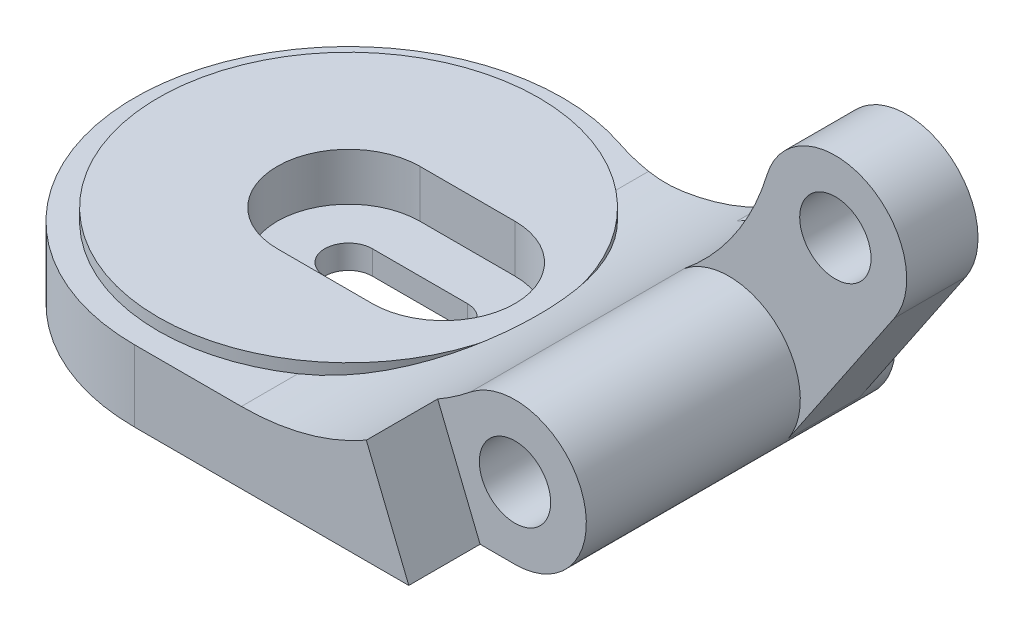
ISO-10303-21;
HEADER;
FILE_DESCRIPTION(('STEP AP214'),'2;1');
FILE_NAME('part.step','',(''),(''),'','','');
FILE_SCHEMA(('AUTOMOTIVE_DESIGN { 1 0 10303 214 1 1 1 1 }'));
ENDSEC;
DATA;
#1=APPLICATION_CONTEXT('core data for automotive mechanical design processes');
#2=APPLICATION_PROTOCOL_DEFINITION('international standard','automotive_design',2000,#1);
#3=PRODUCT_CONTEXT('',#1,'mechanical');
#4=PRODUCT('Part','Part','',(#3));
#5=PRODUCT_RELATED_PRODUCT_CATEGORY('part','',(#4));
#6=PRODUCT_DEFINITION_FORMATION('','',#4);
#7=PRODUCT_DEFINITION_CONTEXT('part definition',#1,'design');
#8=PRODUCT_DEFINITION('design','',#6,#7);
#9=PRODUCT_DEFINITION_SHAPE('','',#8);
#10=(LENGTH_UNIT() NAMED_UNIT(*) SI_UNIT(.MILLI.,.METRE.));
#11=(NAMED_UNIT(*) PLANE_ANGLE_UNIT() SI_UNIT($,.RADIAN.));
#12=(NAMED_UNIT(*) SI_UNIT($,.STERADIAN.) SOLID_ANGLE_UNIT());
#13=UNCERTAINTY_MEASURE_WITH_UNIT(LENGTH_MEASURE(1.E-05),#10,'distance_accuracy_value','');
#14=(GEOMETRIC_REPRESENTATION_CONTEXT(3) GLOBAL_UNCERTAINTY_ASSIGNED_CONTEXT((#13)) GLOBAL_UNIT_ASSIGNED_CONTEXT((#10,
#11,#12)) REPRESENTATION_CONTEXT('',''));
#15=CARTESIAN_POINT('',(0.,0.,0.));
#16=DIRECTION('',(0.,0.,1.));
#17=DIRECTION('',(1.,0.,0.));
#18=AXIS2_PLACEMENT_3D('',#15,#16,#17);
#19=CARTESIAN_POINT('',(0.,3.5,0.));
#20=DIRECTION('',(0.,-1.,0.));
#21=DIRECTION('',(0.,0.,-1.));
#22=AXIS2_PLACEMENT_3D('',#19,#20,#21);
#23=CYLINDRICAL_SURFACE('',#22,8.);
#24=CARTESIAN_POINT('',(0.,3.5,0.));
#25=DIRECTION('',(0.,1.,0.));
#26=DIRECTION('',(0.,0.,1.));
#27=AXIS2_PLACEMENT_3D('',#24,#25,#26);
#28=CIRCLE('',#27,8.);
#29=CARTESIAN_POINT('',(0.,3.5,8.));
#30=VERTEX_POINT('',#29);
#31=EDGE_CURVE('E215',#30,#30,#28,.T.);
#32=ORIENTED_EDGE('',*,*,#31,.F.);
#33=EDGE_LOOP('',(#32));
#34=FACE_BOUND('',#33,.T.);
#35=CARTESIAN_POINT('',(0.,0.5,0.));
#36=DIRECTION('',(0.,1.,0.));
#37=DIRECTION('',(0.,0.,1.));
#38=AXIS2_PLACEMENT_3D('',#35,#36,#37);
#39=CIRCLE('',#38,8.);
#40=CARTESIAN_POINT('',(0.,0.5,8.));
#41=VERTEX_POINT('',#40);
#42=EDGE_CURVE('E208',#41,#41,#39,.T.);
#43=ORIENTED_EDGE('',*,*,#42,.T.);
#44=EDGE_LOOP('',(#43));
#45=FACE_BOUND('',#44,.T.);
#46=ADVANCED_FACE('F91',(#34,#45),#23,.T.);
#47=CARTESIAN_POINT('',(0.,3.5,0.));
#48=DIRECTION('',(0.,1.,0.));
#49=DIRECTION('',(0.,0.,1.));
#50=AXIS2_PLACEMENT_3D('',#47,#48,#49);
#51=PLANE('',#50);
#52=DIRECTION('',(1.,0.,0.));
#53=VECTOR('',#52,1.);
#54=CARTESIAN_POINT('',(0.,3.5,3.));
#55=LINE('',#54,#53);
#56=CARTESIAN_POINT('',(0.,3.5,3.));
#57=VERTEX_POINT('',#56);
#58=CARTESIAN_POINT('',(4.,3.5,3.));
#59=VERTEX_POINT('',#58);
#60=EDGE_CURVE('E180',#57,#59,#55,.T.);
#61=ORIENTED_EDGE('',*,*,#60,.F.);
#62=CARTESIAN_POINT('',(0.,3.5,0.));
#63=DIRECTION('',(0.,1.,0.));
#64=DIRECTION('',(0.,0.,1.));
#65=AXIS2_PLACEMENT_3D('',#62,#63,#64);
#66=CIRCLE('',#65,3.);
#67=CARTESIAN_POINT('',(0.,3.5,-3.));
#68=VERTEX_POINT('',#67);
#69=EDGE_CURVE('E188',#68,#57,#66,.T.);
#70=ORIENTED_EDGE('',*,*,#69,.F.);
#71=DIRECTION('',(1.,0.,0.));
#72=VECTOR('',#71,1.);
#73=CARTESIAN_POINT('',(0.,3.5,-3.));
#74=LINE('',#73,#72);
#75=CARTESIAN_POINT('',(4.,3.5,-3.));
#76=VERTEX_POINT('',#75);
#77=EDGE_CURVE('E201',#68,#76,#74,.T.);
#78=ORIENTED_EDGE('',*,*,#77,.T.);
#79=CARTESIAN_POINT('',(4.,3.5,0.));
#80=DIRECTION('',(0.,1.,0.));
#81=DIRECTION('',(0.,0.,1.));
#82=AXIS2_PLACEMENT_3D('',#79,#80,#81);
#83=CIRCLE('',#82,3.);
#84=EDGE_CURVE('E198',#59,#76,#83,.T.);
#85=ORIENTED_EDGE('',*,*,#84,.F.);
#86=EDGE_LOOP('',(#61,#70,#78,#85));
#87=FACE_BOUND('',#86,.T.);
#88=ORIENTED_EDGE('',*,*,#31,.T.);
#89=EDGE_LOOP('',(#88));
#90=FACE_BOUND('',#89,.T.);
#91=ADVANCED_FACE('F239',(#87,#90),#51,.T.);
#92=CARTESIAN_POINT('',(0.,0.5,0.));
#93=DIRECTION('',(0.,1.,0.));
#94=DIRECTION('',(0.,0.,1.));
#95=AXIS2_PLACEMENT_3D('',#92,#93,#94);
#96=PLANE('',#95);
#97=DIRECTION('',(1.,0.,0.));
#98=VECTOR('',#97,1.);
#99=CARTESIAN_POINT('',(0.,0.5,1.));
#100=LINE('',#99,#98);
#101=CARTESIAN_POINT('',(0.,0.5,1.));
#102=VERTEX_POINT('',#101);
#103=CARTESIAN_POINT('',(4.,0.5,1.));
#104=VERTEX_POINT('',#103);
#105=EDGE_CURVE('E98',#102,#104,#100,.T.);
#106=ORIENTED_EDGE('',*,*,#105,.T.);
#107=CARTESIAN_POINT('',(4.,0.5,0.));
#108=DIRECTION('',(0.,1.,0.));
#109=DIRECTION('',(0.,0.,1.));
#110=AXIS2_PLACEMENT_3D('',#107,#108,#109);
#111=CIRCLE('',#110,1.);
#112=CARTESIAN_POINT('',(4.,0.5,-1.));
#113=VERTEX_POINT('',#112);
#114=EDGE_CURVE('E13',#104,#113,#111,.T.);
#115=ORIENTED_EDGE('',*,*,#114,.T.);
#116=DIRECTION('',(-1.,0.,0.));
#117=VECTOR('',#116,1.);
#118=CARTESIAN_POINT('',(0.,0.5,-1.));
#119=LINE('',#118,#117);
#120=CARTESIAN_POINT('',(0.,0.5,-1.));
#121=VERTEX_POINT('',#120);
#122=EDGE_CURVE('E160',#113,#121,#119,.T.);
#123=ORIENTED_EDGE('',*,*,#122,.T.);
#124=CARTESIAN_POINT('',(0.,0.5,0.));
#125=DIRECTION('',(0.,1.,0.));
#126=DIRECTION('',(0.,0.,1.));
#127=AXIS2_PLACEMENT_3D('',#124,#125,#126);
#128=CIRCLE('',#127,1.);
#129=EDGE_CURVE('E221',#121,#102,#128,.T.);
#130=ORIENTED_EDGE('',*,*,#129,.T.);
#131=EDGE_LOOP('',(#106,#115,#123,#130));
#132=FACE_BOUND('',#131,.T.);
#133=ORIENTED_EDGE('',*,*,#42,.F.);
#134=EDGE_LOOP('',(#133));
#135=FACE_BOUND('',#134,.T.);
#136=ADVANCED_FACE('F225',(#132,#135),#96,.F.);
#137=CARTESIAN_POINT('',(0.,1.5,3.));
#138=DIRECTION('',(0.,0.,1.));
#139=DIRECTION('',(1.,0.,0.));
#140=AXIS2_PLACEMENT_3D('',#137,#138,#139);
#141=PLANE('',#140);
#142=ORIENTED_EDGE('',*,*,#60,.T.);
#143=DIRECTION('',(0.,1.,0.));
#144=VECTOR('',#143,1.);
#145=CARTESIAN_POINT('',(4.,1.5,3.));
#146=LINE('',#145,#144);
#147=CARTESIAN_POINT('',(4.,1.5,3.));
#148=VERTEX_POINT('',#147);
#149=EDGE_CURVE('E196',#148,#59,#146,.T.);
#150=ORIENTED_EDGE('',*,*,#149,.F.);
#151=DIRECTION('',(1.,0.,0.));
#152=VECTOR('',#151,1.);
#153=CARTESIAN_POINT('',(0.,1.5,3.));
#154=LINE('',#153,#152);
#155=CARTESIAN_POINT('',(0.,1.5,3.));
#156=VERTEX_POINT('',#155);
#157=EDGE_CURVE('E184',#156,#148,#154,.T.);
#158=ORIENTED_EDGE('',*,*,#157,.F.);
#159=DIRECTION('',(0.,1.,0.));
#160=VECTOR('',#159,1.);
#161=CARTESIAN_POINT('',(0.,1.5,3.));
#162=LINE('',#161,#160);
#163=EDGE_CURVE('E206',#156,#57,#162,.T.);
#164=ORIENTED_EDGE('',*,*,#163,.T.);
#165=EDGE_LOOP('',(#142,#150,#158,#164));
#166=FACE_BOUND('',#165,.T.);
#167=ADVANCED_FACE('F250',(#166),#141,.F.);
#168=CARTESIAN_POINT('',(0.,1.5,0.));
#169=DIRECTION('',(0.,1.,0.));
#170=DIRECTION('',(0.,0.,1.));
#171=AXIS2_PLACEMENT_3D('',#168,#169,#170);
#172=CYLINDRICAL_SURFACE('',#171,3.);
#173=ORIENTED_EDGE('',*,*,#69,.T.);
#174=ORIENTED_EDGE('',*,*,#163,.F.);
#175=CARTESIAN_POINT('',(0.,1.5,0.));
#176=DIRECTION('',(0.,1.,0.));
#177=DIRECTION('',(0.,0.,1.));
#178=AXIS2_PLACEMENT_3D('',#175,#176,#177);
#179=CIRCLE('',#178,3.);
#180=CARTESIAN_POINT('',(0.,1.5,-3.));
#181=VERTEX_POINT('',#180);
#182=EDGE_CURVE('E193',#181,#156,#179,.T.);
#183=ORIENTED_EDGE('',*,*,#182,.F.);
#184=DIRECTION('',(0.,1.,0.));
#185=VECTOR('',#184,1.);
#186=CARTESIAN_POINT('',(0.,1.5,-3.));
#187=LINE('',#186,#185);
#188=EDGE_CURVE('E209',#181,#68,#187,.T.);
#189=ORIENTED_EDGE('',*,*,#188,.T.);
#190=EDGE_LOOP('',(#173,#174,#183,#189));
#191=FACE_BOUND('',#190,.T.);
#192=ADVANCED_FACE('F254',(#191),#172,.F.);
#193=CARTESIAN_POINT('',(0.,1.5,-3.));
#194=DIRECTION('',(0.,0.,1.));
#195=DIRECTION('',(1.,0.,0.));
#196=AXIS2_PLACEMENT_3D('',#193,#194,#195);
#197=PLANE('',#196);
#198=ORIENTED_EDGE('',*,*,#77,.F.);
#199=ORIENTED_EDGE('',*,*,#188,.F.);
#200=DIRECTION('',(1.,0.,0.));
#201=VECTOR('',#200,1.);
#202=CARTESIAN_POINT('',(0.,1.5,-3.));
#203=LINE('',#202,#201);
#204=CARTESIAN_POINT('',(4.,1.5,-3.));
#205=VERTEX_POINT('',#204);
#206=EDGE_CURVE('E191',#181,#205,#203,.T.);
#207=ORIENTED_EDGE('',*,*,#206,.T.);
#208=DIRECTION('',(0.,1.,0.));
#209=VECTOR('',#208,1.);
#210=CARTESIAN_POINT('',(4.,1.5,-3.));
#211=LINE('',#210,#209);
#212=EDGE_CURVE('E211',#205,#76,#211,.T.);
#213=ORIENTED_EDGE('',*,*,#212,.T.);
#214=EDGE_LOOP('',(#198,#199,#207,#213));
#215=FACE_BOUND('',#214,.T.);
#216=ADVANCED_FACE('F261',(#215),#197,.T.);
#217=CARTESIAN_POINT('',(4.,1.5,0.));
#218=DIRECTION('',(0.,1.,0.));
#219=DIRECTION('',(0.,0.,1.));
#220=AXIS2_PLACEMENT_3D('',#217,#218,#219);
#221=CYLINDRICAL_SURFACE('',#220,3.);
#222=ORIENTED_EDGE('',*,*,#84,.T.);
#223=ORIENTED_EDGE('',*,*,#212,.F.);
#224=CARTESIAN_POINT('',(4.,1.5,0.));
#225=DIRECTION('',(0.,1.,0.));
#226=DIRECTION('',(0.,0.,1.));
#227=AXIS2_PLACEMENT_3D('',#224,#225,#226);
#228=CIRCLE('',#227,3.);
#229=EDGE_CURVE('E187',#148,#205,#228,.T.);
#230=ORIENTED_EDGE('',*,*,#229,.F.);
#231=ORIENTED_EDGE('',*,*,#149,.T.);
#232=EDGE_LOOP('',(#222,#223,#230,#231));
#233=FACE_BOUND('',#232,.T.);
#234=ADVANCED_FACE('F258',(#233),#221,.F.);
#235=CARTESIAN_POINT('',(0.,1.5,0.));
#236=DIRECTION('',(0.,1.,0.));
#237=DIRECTION('',(0.,0.,1.));
#238=AXIS2_PLACEMENT_3D('',#235,#236,#237);
#239=PLANE('',#238);
#240=CARTESIAN_POINT('',(4.,1.5,0.));
#241=DIRECTION('',(0.,1.,0.));
#242=DIRECTION('',(0.,0.,1.));
#243=AXIS2_PLACEMENT_3D('',#240,#241,#242);
#244=CIRCLE('',#243,1.);
#245=CARTESIAN_POINT('',(4.,1.5,1.));
#246=VERTEX_POINT('',#245);
#247=CARTESIAN_POINT('',(4.,1.5,-1.));
#248=VERTEX_POINT('',#247);
#249=EDGE_CURVE('E165',#246,#248,#244,.T.);
#250=ORIENTED_EDGE('',*,*,#249,.F.);
#251=DIRECTION('',(1.,0.,0.));
#252=VECTOR('',#251,1.);
#253=CARTESIAN_POINT('',(0.,1.5,1.));
#254=LINE('',#253,#252);
#255=CARTESIAN_POINT('',(0.,1.5,1.));
#256=VERTEX_POINT('',#255);
#257=EDGE_CURVE('E162',#256,#246,#254,.T.);
#258=ORIENTED_EDGE('',*,*,#257,.F.);
#259=CARTESIAN_POINT('',(0.,1.5,0.));
#260=DIRECTION('',(0.,1.,0.));
#261=DIRECTION('',(0.,0.,1.));
#262=AXIS2_PLACEMENT_3D('',#259,#260,#261);
#263=CIRCLE('',#262,1.);
#264=CARTESIAN_POINT('',(0.,1.5,-1.));
#265=VERTEX_POINT('',#264);
#266=EDGE_CURVE('E105',#265,#256,#263,.T.);
#267=ORIENTED_EDGE('',*,*,#266,.F.);
#268=DIRECTION('',(-1.,0.,0.));
#269=VECTOR('',#268,1.);
#270=CARTESIAN_POINT('',(4.,1.5,-1.));
#271=LINE('',#270,#269);
#272=EDGE_CURVE('E158',#248,#265,#271,.T.);
#273=ORIENTED_EDGE('',*,*,#272,.F.);
#274=EDGE_LOOP('',(#250,#258,#267,#273));
#275=FACE_BOUND('',#274,.T.);
#276=ORIENTED_EDGE('',*,*,#157,.T.);
#277=ORIENTED_EDGE('',*,*,#229,.T.);
#278=ORIENTED_EDGE('',*,*,#206,.F.);
#279=ORIENTED_EDGE('',*,*,#182,.T.);
#280=EDGE_LOOP('',(#276,#277,#278,#279));
#281=FACE_BOUND('',#280,.T.);
#282=ADVANCED_FACE('F173',(#275,#281),#239,.T.);
#283=CARTESIAN_POINT('',(4.,-0.5,0.));
#284=DIRECTION('',(0.,1.,0.));
#285=DIRECTION('',(0.,0.,1.));
#286=AXIS2_PLACEMENT_3D('',#283,#284,#285);
#287=CYLINDRICAL_SURFACE('',#286,1.);
#288=DIRECTION('',(0.,1.,0.));
#289=VECTOR('',#288,1.);
#290=CARTESIAN_POINT('',(4.,-0.5,1.));
#291=LINE('',#290,#289);
#292=EDGE_CURVE('E168',#104,#246,#291,.T.);
#293=ORIENTED_EDGE('',*,*,#292,.T.);
#294=ORIENTED_EDGE('',*,*,#249,.T.);
#295=DIRECTION('',(0.,1.,0.));
#296=VECTOR('',#295,1.);
#297=CARTESIAN_POINT('',(4.,-0.5,-1.));
#298=LINE('',#297,#296);
#299=EDGE_CURVE('E154',#113,#248,#298,.T.);
#300=ORIENTED_EDGE('',*,*,#299,.F.);
#301=ORIENTED_EDGE('',*,*,#114,.F.);
#302=EDGE_LOOP('',(#293,#294,#300,#301));
#303=FACE_BOUND('',#302,.T.);
#304=ADVANCED_FACE('F166',(#303),#287,.F.);
#305=CARTESIAN_POINT('',(0.,-0.5,1.));
#306=DIRECTION('',(0.,0.,1.));
#307=DIRECTION('',(1.,0.,0.));
#308=AXIS2_PLACEMENT_3D('',#305,#306,#307);
#309=PLANE('',#308);
#310=DIRECTION('',(0.,1.,0.));
#311=VECTOR('',#310,1.);
#312=CARTESIAN_POINT('',(0.,-0.5,1.));
#313=LINE('',#312,#311);
#314=EDGE_CURVE('E181',#102,#256,#313,.T.);
#315=ORIENTED_EDGE('',*,*,#314,.T.);
#316=ORIENTED_EDGE('',*,*,#257,.T.);
#317=ORIENTED_EDGE('',*,*,#292,.F.);
#318=ORIENTED_EDGE('',*,*,#105,.F.);
#319=EDGE_LOOP('',(#315,#316,#317,#318));
#320=FACE_BOUND('',#319,.T.);
#321=ADVANCED_FACE('F228',(#320),#309,.F.);
#322=CARTESIAN_POINT('',(0.,-0.5,0.));
#323=DIRECTION('',(0.,1.,0.));
#324=DIRECTION('',(0.,0.,1.));
#325=AXIS2_PLACEMENT_3D('',#322,#323,#324);
#326=CYLINDRICAL_SURFACE('',#325,1.);
#327=DIRECTION('',(0.,1.,0.));
#328=VECTOR('',#327,1.);
#329=CARTESIAN_POINT('',(0.,-0.5,-1.));
#330=LINE('',#329,#328);
#331=EDGE_CURVE('E112',#121,#265,#330,.T.);
#332=ORIENTED_EDGE('',*,*,#331,.T.);
#333=ORIENTED_EDGE('',*,*,#266,.T.);
#334=ORIENTED_EDGE('',*,*,#314,.F.);
#335=ORIENTED_EDGE('',*,*,#129,.F.);
#336=EDGE_LOOP('',(#332,#333,#334,#335));
#337=FACE_BOUND('',#336,.T.);
#338=ADVANCED_FACE('F229',(#337),#326,.F.);
#339=CARTESIAN_POINT('',(4.,-0.5,-1.));
#340=DIRECTION('',(0.,0.,-1.));
#341=DIRECTION('',(-1.,0.,0.));
#342=AXIS2_PLACEMENT_3D('',#339,#340,#341);
#343=PLANE('',#342);
#344=ORIENTED_EDGE('',*,*,#299,.T.);
#345=ORIENTED_EDGE('',*,*,#272,.T.);
#346=ORIENTED_EDGE('',*,*,#331,.F.);
#347=ORIENTED_EDGE('',*,*,#122,.F.);
#348=EDGE_LOOP('',(#344,#345,#346,#347));
#349=FACE_BOUND('',#348,.T.);
#350=ADVANCED_FACE('F156',(#349),#343,.F.);
#351=CLOSED_SHELL('',(#46,#91,#136,#167,#192,#216,#234,#282,#304,#321,#338,#350));
#352=MANIFOLD_SOLID_BREP('B2_NOT_SHOWN',#351);
#353=CARTESIAN_POINT('',(0.,0.,-6.));
#354=DIRECTION('',(0.,0.,1.));
#355=DIRECTION('',(1.,0.,0.));
#356=AXIS2_PLACEMENT_3D('',#353,#354,#355);
#357=PLANE('',#356);
#358=CARTESIAN_POINT('',(4.4923487244632,13.5633550376905,-6.));
#359=DIRECTION('',(0.,0.,1.));
#360=DIRECTION('',(1.,0.,0.));
#361=AXIS2_PLACEMENT_3D('',#358,#359,#360);
#362=CIRCLE('',#361,10.5633550376905);
#363=CARTESIAN_POINT('',(11.1182418541957,5.33644736313468,-6.));
#364=VERTEX_POINT('',#363);
#365=CARTESIAN_POINT('',(14.6023079469899,10.5017877640302,-6.));
#366=VERTEX_POINT('',#365);
#367=EDGE_CURVE('E540',#364,#366,#362,.T.);
#368=ORIENTED_EDGE('',*,*,#367,.T.);
#369=CARTESIAN_POINT('',(17.473543227766,9.63230058044034,-6.));
#370=DIRECTION('',(0.,0.,1.));
#371=DIRECTION('',(1.,0.,0.));
#372=AXIS2_PLACEMENT_3D('',#369,#370,#371);
#373=CIRCLE('',#372,3.);
#374=CARTESIAN_POINT('',(19.9606559454311,7.95472187002811,-6.));
#375=VERTEX_POINT('',#374);
#376=EDGE_CURVE('E525',#375,#366,#373,.T.);
#377=ORIENTED_EDGE('',*,*,#376,.F.);
#378=DIRECTION('',(0.559192903470745,0.829037572555043,0.));
#379=VECTOR('',#378,1.);
#380=CARTESIAN_POINT('',(10.0312797930184,-6.76618365522022,-6.));
#381=LINE('',#380,#379);
#382=CARTESIAN_POINT('',(15.4871127176651,1.32242128958777,-6.));
#383=VERTEX_POINT('',#382);
#384=EDGE_CURVE('E531',#383,#375,#381,.T.);
#385=ORIENTED_EDGE('',*,*,#384,.F.);
#386=CARTESIAN_POINT('',(13.,3.,-6.));
#387=DIRECTION('',(0.,0.,1.));
#388=DIRECTION('',(1.,0.,0.));
#389=AXIS2_PLACEMENT_3D('',#386,#387,#388);
#390=CIRCLE('',#389,3.);
#391=EDGE_CURVE('E544',#383,#364,#390,.T.);
#392=ORIENTED_EDGE('',*,*,#391,.T.);
#393=EDGE_LOOP('',(#368,#377,#385,#392));
#394=FACE_BOUND('',#393,.T.);
#395=CARTESIAN_POINT('',(17.473543227766,9.63230058044034,-6.));
#396=DIRECTION('',(0.,0.,-1.));
#397=DIRECTION('',(-1.,0.,0.));
#398=AXIS2_PLACEMENT_3D('',#395,#396,#397);
#399=CIRCLE('',#398,1.49999999999999);
#400=CARTESIAN_POINT('',(15.973543227766,9.63230058044034,-6.));
#401=VERTEX_POINT('',#400);
#402=EDGE_CURVE('E757',#401,#401,#399,.T.);
#403=ORIENTED_EDGE('',*,*,#402,.F.);
#404=EDGE_LOOP('',(#403));
#405=FACE_BOUND('',#404,.T.);
#406=ADVANCED_FACE('F350',(#394,#405),#357,.F.);
#407=CARTESIAN_POINT('',(13.,3.,9.));
#408=DIRECTION('',(0.,0.,-1.));
#409=DIRECTION('',(-1.,0.,0.));
#410=AXIS2_PLACEMENT_3D('',#407,#408,#409);
#411=CYLINDRICAL_SURFACE('',#410,3.);
#412=CARTESIAN_POINT('',(13.,3.,6.));
#413=DIRECTION('',(0.,0.,1.));
#414=DIRECTION('',(1.,0.,0.));
#415=AXIS2_PLACEMENT_3D('',#412,#413,#414);
#416=CIRCLE('',#415,3.);
#417=CARTESIAN_POINT('',(13.,0.,6.));
#418=VERTEX_POINT('',#417);
#419=CARTESIAN_POINT('',(11.1182418541957,5.33644736313468,6.));
#420=VERTEX_POINT('',#419);
#421=EDGE_CURVE('E495',#418,#420,#416,.T.);
#422=ORIENTED_EDGE('',*,*,#421,.F.);
#423=DIRECTION('',(0.,0.,-1.));
#424=VECTOR('',#423,1.);
#425=CARTESIAN_POINT('',(13.,0.,9.));
#426=LINE('',#425,#424);
#427=CARTESIAN_POINT('',(13.,0.,-7.));
#428=VERTEX_POINT('',#427);
#429=EDGE_CURVE('E493',#418,#428,#426,.T.);
#430=ORIENTED_EDGE('',*,*,#429,.T.);
#431=CARTESIAN_POINT('',(13.,3.,-7.));
#432=DIRECTION('',(0.,0.,1.));
#433=DIRECTION('',(1.,0.,0.));
#434=AXIS2_PLACEMENT_3D('',#431,#432,#433);
#435=CIRCLE('',#434,3.);
#436=CARTESIAN_POINT('',(11.1182418541957,5.33644736313468,-7.));
#437=VERTEX_POINT('',#436);
#438=EDGE_CURVE('E520',#428,#437,#435,.T.);
#439=ORIENTED_EDGE('',*,*,#438,.T.);
#440=DIRECTION('',(0.,0.,-1.));
#441=VECTOR('',#440,1.);
#442=CARTESIAN_POINT('',(11.1182418541957,5.33644736313468,9.));
#443=LINE('',#442,#441);
#444=EDGE_CURVE('E582',#364,#437,#443,.T.);
#445=ORIENTED_EDGE('',*,*,#444,.F.);
#446=ORIENTED_EDGE('',*,*,#391,.F.);
#447=DIRECTION('',(0.,0.,-1.));
#448=VECTOR('',#447,1.);
#449=CARTESIAN_POINT('',(15.4871127176651,1.32242128958777,-3.));
#450=LINE('',#449,#448);
#451=CARTESIAN_POINT('',(15.4871127176651,1.32242128958777,-3.));
#452=VERTEX_POINT('',#451);
#453=EDGE_CURVE('E554',#452,#383,#450,.T.);
#454=ORIENTED_EDGE('',*,*,#453,.F.);
#455=CARTESIAN_POINT('',(13.,3.,-3.));
#456=DIRECTION('',(0.,0.,1.));
#457=DIRECTION('',(1.,0.,0.));
#458=AXIS2_PLACEMENT_3D('',#455,#456,#457);
#459=CIRCLE('',#458,3.);
#460=CARTESIAN_POINT('',(11.1182418541957,5.33644736313468,-3.));
#461=VERTEX_POINT('',#460);
#462=EDGE_CURVE('E530',#452,#461,#459,.T.);
#463=ORIENTED_EDGE('',*,*,#462,.T.);
#464=EDGE_CURVE('E583',#420,#461,#443,.T.);
#465=ORIENTED_EDGE('',*,*,#464,.F.);
#466=EDGE_LOOP('',(#422,#430,#439,#445,#446,#454,#463,#465));
#467=FACE_BOUND('',#466,.T.);
#468=ADVANCED_FACE('F634',(#467),#411,.T.);
#469=CARTESIAN_POINT('',(0.,0.,0.));
#470=DIRECTION('',(0.,1.,0.));
#471=DIRECTION('',(0.,0.,1.));
#472=AXIS2_PLACEMENT_3D('',#469,#470,#471);
#473=PLANE('',#472);
#474=CARTESIAN_POINT('',(0.,0.,0.));
#475=DIRECTION('',(0.,1.,0.));
#476=DIRECTION('',(0.,0.,1.));
#477=AXIS2_PLACEMENT_3D('',#474,#475,#476);
#478=CIRCLE('',#477,6.);
#479=CARTESIAN_POINT('',(0.,0.,6.));
#480=VERTEX_POINT('',#479);
#481=EDGE_CURVE('E509',#480,#480,#478,.T.);
#482=ORIENTED_EDGE('',*,*,#481,.T.);
#483=EDGE_LOOP('',(#482));
#484=FACE_BOUND('',#483,.T.);
#485=DIRECTION('',(1.,0.,0.));
#486=VECTOR('',#485,1.);
#487=CARTESIAN_POINT('',(0.,0.,-8.));
#488=LINE('',#487,#486);
#489=CARTESIAN_POINT('',(6.08276253029821,0.,-8.));
#490=VERTEX_POINT('',#489);
#491=CARTESIAN_POINT('',(10.5505102572168,0.,-8.));
#492=VERTEX_POINT('',#491);
#493=EDGE_CURVE('E570',#490,#492,#488,.T.);
#494=ORIENTED_EDGE('',*,*,#493,.T.);
#495=DIRECTION('',(0.,0.,1.));
#496=VECTOR('',#495,1.);
#497=CARTESIAN_POINT('',(10.5505102572168,0.,0.));
#498=LINE('',#497,#496);
#499=CARTESIAN_POINT('',(10.5505102572168,0.,-7.));
#500=VERTEX_POINT('',#499);
#501=EDGE_CURVE('E786',#492,#500,#498,.T.);
#502=ORIENTED_EDGE('',*,*,#501,.T.);
#503=DIRECTION('',(1.,0.,0.));
#504=VECTOR('',#503,1.);
#505=CARTESIAN_POINT('',(0.,0.,-7.));
#506=LINE('',#505,#504);
#507=EDGE_CURVE('E649',#500,#428,#506,.T.);
#508=ORIENTED_EDGE('',*,*,#507,.T.);
#509=ORIENTED_EDGE('',*,*,#429,.F.);
#510=DIRECTION('',(1.,0.,0.));
#511=VECTOR('',#510,1.);
#512=CARTESIAN_POINT('',(0.,0.,6.));
#513=LINE('',#512,#511);
#514=CARTESIAN_POINT('',(11.532894229754,0.,6.));
#515=VERTEX_POINT('',#514);
#516=EDGE_CURVE('E483',#515,#418,#513,.T.);
#517=ORIENTED_EDGE('',*,*,#516,.F.);
#518=DIRECTION('',(0.,0.,1.));
#519=VECTOR('',#518,1.);
#520=CARTESIAN_POINT('',(11.532894229754,0.,6.));
#521=LINE('',#520,#519);
#522=CARTESIAN_POINT('',(11.532894229754,0.,9.));
#523=VERTEX_POINT('',#522);
#524=EDGE_CURVE('E466',#515,#523,#521,.T.);
#525=ORIENTED_EDGE('',*,*,#524,.T.);
#526=DIRECTION('',(1.,0.,0.));
#527=VECTOR('',#526,1.);
#528=CARTESIAN_POINT('',(0.,0.,9.));
#529=LINE('',#528,#527);
#530=CARTESIAN_POINT('',(0.,0.,9.));
#531=VERTEX_POINT('',#530);
#532=EDGE_CURVE('E578',#531,#523,#529,.T.);
#533=ORIENTED_EDGE('',*,*,#532,.F.);
#534=CARTESIAN_POINT('',(0.,0.,0.));
#535=DIRECTION('',(0.,1.,0.));
#536=DIRECTION('',(0.,0.,1.));
#537=AXIS2_PLACEMENT_3D('',#534,#535,#536);
#538=CIRCLE('',#537,9.);
#539=CARTESIAN_POINT('',(2.88130856698336,0.,-8.52631578947368));
#540=VERTEX_POINT('',#539);
#541=EDGE_CURVE('E588',#540,#531,#538,.T.);
#542=ORIENTED_EDGE('',*,*,#541,.F.);
#543=CARTESIAN_POINT('',(6.08276253029821,0.,-18.));
#544=DIRECTION('',(0.,1.,0.));
#545=DIRECTION('',(0.,0.,1.));
#546=AXIS2_PLACEMENT_3D('',#543,#544,#545);
#547=CIRCLE('',#546,10.);
#548=EDGE_CURVE('E697',#540,#490,#547,.T.);
#549=ORIENTED_EDGE('',*,*,#548,.T.);
#550=EDGE_LOOP('',(#494,#502,#508,#509,#517,#525,#533,#542,#549));
#551=FACE_BOUND('',#550,.T.);
#552=ADVANCED_FACE('F491',(#484,#551),#473,.F.);
#553=CARTESIAN_POINT('',(4.4923487244632,13.5633550376905,9.));
#554=DIRECTION('',(0.,0.,-1.));
#555=DIRECTION('',(-1.,0.,0.));
#556=AXIS2_PLACEMENT_3D('',#553,#554,#555);
#557=CYLINDRICAL_SURFACE('',#556,10.5633550376905);
#558=ORIENTED_EDGE('',*,*,#444,.T.);
#559=CARTESIAN_POINT('',(4.4923487244632,13.5633550376905,-7.));
#560=DIRECTION('',(0.,0.,1.));
#561=DIRECTION('',(1.,0.,0.));
#562=AXIS2_PLACEMENT_3D('',#559,#560,#561);
#563=CIRCLE('',#562,10.5633550376905);
#564=CARTESIAN_POINT('',(9.34894325118954,4.18263229073368,-7.));
#565=VERTEX_POINT('',#564);
#566=EDGE_CURVE('E365',#437,#565,#563,.F.);
#567=ORIENTED_EDGE('',*,*,#566,.T.);
#568=DIRECTION('',(0.,0.,-1.));
#569=VECTOR('',#568,1.);
#570=CARTESIAN_POINT('',(9.34894325118954,4.18263229073368,9.));
#571=LINE('',#570,#569);
#572=CARTESIAN_POINT('',(9.34894325118954,4.18263229073368,-8.));
#573=VERTEX_POINT('',#572);
#574=EDGE_CURVE('E792',#565,#573,#571,.T.);
#575=ORIENTED_EDGE('',*,*,#574,.T.);
#576=CARTESIAN_POINT('',(4.4923487244632,13.5633550376905,-8.));
#577=DIRECTION('',(0.,0.,1.));
#578=DIRECTION('',(1.,0.,0.));
#579=AXIS2_PLACEMENT_3D('',#576,#577,#578);
#580=CIRCLE('',#579,10.5633550376905);
#581=CARTESIAN_POINT('',(6.08276253029821,3.12041227338739,-8.));
#582=VERTEX_POINT('',#581);
#583=EDGE_CURVE('E560',#582,#573,#580,.T.);
#584=ORIENTED_EDGE('',*,*,#583,.F.);
#585=CARTESIAN_POINT('',(6.08276253029821,3.12041227338739,-8.));
#586=CARTESIAN_POINT('',(5.95048328415925,3.10025999980358,-7.99999347044727));
#587=CARTESIAN_POINT('',(5.81781772120311,3.08263402456899,-8.00262469026414));
#588=CARTESIAN_POINT('',(5.55252298215397,3.05249237436494,-8.01318950711376));
#589=CARTESIAN_POINT('',(5.41989489790364,3.03996148099893,-8.02110712431173));
#590=CARTESIAN_POINT('',(5.15468310464146,3.01994631130099,-8.04227110923852));
#591=CARTESIAN_POINT('',(5.02209939562949,3.01246203495639,-8.05551747695397));
#592=CARTESIAN_POINT('',(4.7569822111005,3.00247803440532,-8.08737074913617));
#593=CARTESIAN_POINT('',(4.62445009506154,2.99999342327213,-8.10599371265242));
#594=CARTESIAN_POINT('',(4.4923487244632,3.,-8.12728082409869));
#595=B_SPLINE_CURVE_WITH_KNOTS('',3,(#585,#586,#587,#588,#589,#590,#591,#592,#593,#594),
.UNSPECIFIED.,.F.,.F.,(4,2,2,2,4),(0.,0.401368406939617,0.801529008913992,1.20168960988453,
1.6030580169325),.UNSPECIFIED.);
#596=CARTESIAN_POINT('',(4.4923487244632,3.,-8.12728082409869));
#597=VERTEX_POINT('',#596);
#598=EDGE_CURVE('E612',#582,#597,#595,.T.);
#599=ORIENTED_EDGE('',*,*,#598,.T.);
#600=DIRECTION('',(0.,0.,-1.));
#601=VECTOR('',#600,1.);
#602=CARTESIAN_POINT('',(4.4923487244632,3.,9.));
#603=LINE('',#602,#601);
#604=CARTESIAN_POINT('',(4.4923487244632,3.,-6.61957724766573));
#605=VERTEX_POINT('',#604);
#606=EDGE_CURVE('E601',#597,#605,#603,.F.);
#607=ORIENTED_EDGE('',*,*,#606,.T.);
#608=CARTESIAN_POINT('',(4.4923487244632,3.,6.61957724766573));
#609=CARTESIAN_POINT('',(4.67486872115207,2.99998417592002,6.4957496225982));
#610=CARTESIAN_POINT('',(4.85216745753201,3.00472965215614,6.36436652998513));
#611=CARTESIAN_POINT('',(5.19498948706565,3.02200273109352,6.08772717181253));
#612=CARTESIAN_POINT('',(5.36052112642259,3.03452475538491,5.94248091397441));
#613=CARTESIAN_POINT('',(5.67838278559939,3.0655804019457,5.63951375214859));
#614=CARTESIAN_POINT('',(5.83074169230905,3.08410042437539,5.48182167382015));
#615=CARTESIAN_POINT('',(6.12178562461668,3.12539510195279,5.15477039021249));
#616=CARTESIAN_POINT('',(6.26046829493768,3.14817048799723,4.98540918381536));
#617=CARTESIAN_POINT('',(6.52306600793525,3.19617405270001,4.63650595386366));
#618=CARTESIAN_POINT('',(6.64701165101387,3.2213969441183,4.45698621051418));
#619=CARTESIAN_POINT('',(6.87979365614199,3.27264159270408,4.08851191319446));
#620=CARTESIAN_POINT('',(6.9886298121078,3.29866336076183,3.89955723058549));
#621=CARTESIAN_POINT('',(7.19063151147204,3.34990263919651,3.51317157453897));
#622=CARTESIAN_POINT('',(7.28378609760823,3.37511957732191,3.31573479428087));
#623=CARTESIAN_POINT('',(7.45369877241765,3.42320356015604,2.91375472866545));
#624=CARTESIAN_POINT('',(7.53046433738018,3.44607167386259,2.70921473335251));
#625=CARTESIAN_POINT('',(7.66961171252431,3.48888377069405,2.28655867714809));
#626=CARTESIAN_POINT('',(7.73136166010404,3.50868950310747,2.06821990962256));
#627=CARTESIAN_POINT('',(7.83615898185091,3.54305313961673,1.62668212727388));
#628=CARTESIAN_POINT('',(7.87920604785078,3.55761095724203,1.40348303243077));
#629=CARTESIAN_POINT('',(7.94615720817423,3.58052313284781,0.954032149414501));
#630=CARTESIAN_POINT('',(7.97007152689125,3.5888808039651,0.727782057494399));
#631=CARTESIAN_POINT('',(7.99854096362085,3.59885213335432,0.273924051361949));
#632=CARTESIAN_POINT('',(8.00309711702894,3.6004661523188,0.046316210422594));
#633=CARTESIAN_POINT('',(7.99306923540024,3.59693928120148,-0.396740333259188));
#634=CARTESIAN_POINT('',(7.9794540497263,3.59214029914984,-0.612214436358653));
#635=CARTESIAN_POINT('',(7.93489208174719,3.57666788876658,-1.04114190991362));
#636=CARTESIAN_POINT('',(7.90394580116678,3.56599463049187,-1.25459533868452));
#637=CARTESIAN_POINT('',(7.82499159744539,3.53939915184372,-1.67807039766031));
#638=CARTESIAN_POINT('',(7.77697688116396,3.52347484176443,-1.88809062661008));
#639=CARTESIAN_POINT('',(7.66429342312201,3.48730757480733,-2.30323033344054));
#640=CARTESIAN_POINT('',(7.59962431416262,3.46706452271085,-2.50834970315729));
#641=CARTESIAN_POINT('',(7.45392651506498,3.42336878863189,-2.91296081908169));
#642=CARTESIAN_POINT('',(7.37285446276008,3.39990765353338,-3.11243601716367));
#643=CARTESIAN_POINT('',(7.19496260848413,3.35116368606266,-3.50411185844035));
#644=CARTESIAN_POINT('',(7.09813559771102,3.32588002274236,-3.69630912169961));
#645=CARTESIAN_POINT('',(6.88941392203422,3.27500851541471,-4.07211790397399));
#646=CARTESIAN_POINT('',(6.77752981085806,3.24942089580553,-4.2557353163619));
#647=CARTESIAN_POINT('',(6.53926120529307,3.19950293591844,-4.61348545168911));
#648=CARTESIAN_POINT('',(6.41287731515926,3.17517254330886,-4.78761856942549));
#649=CARTESIAN_POINT('',(6.15356878341263,3.13065834009625,-5.11614690575066));
#650=CARTESIAN_POINT('',(6.02137800717409,3.11032066112461,-5.27110069387258));
#651=CARTESIAN_POINT('',(5.74532222745791,3.0736498820551,-5.5707056864334));
#652=CARTESIAN_POINT('',(5.60145940872957,3.05731603481921,-5.71535880945572));
#653=CARTESIAN_POINT('',(5.30253271489256,3.03004551134727,-5.99373832797436));
#654=CARTESIAN_POINT('',(5.14744907040953,3.01911864052714,-6.12744450781752));
#655=CARTESIAN_POINT('',(4.82719805932925,3.00408749926244,-6.38280787938805));
#656=CARTESIAN_POINT('',(4.66202433974717,2.9999875741184,-6.50445735082471));
#657=CARTESIAN_POINT('',(4.4923487244632,3.,-6.61957724766573));
#658=B_SPLINE_CURVE_WITH_KNOTS('',3,(#608,#609,#610,#611,#612,#613,#614,#615,#616,#617,#618,
#619,#620,#621,#622,#623,#624,#625,#626,#627,#628,#629,#630,#631,#632,#633,#634,#635,#636,#637,
#638,#639,#640,#641,#642,#643,#644,#645,#646,#647,#648,#649,#650,#651,#652,#653,#654,#655,#656,
#657),.UNSPECIFIED.,.F.,.F.,(4,2,2,2,2,2,2,2,2,2,2,2,2,2,2,2,2,2,2,2,2,2,2,2,4),(0.,
0.661327638794536,1.3221814295378,1.98154717188504,2.64102627047606,3.29911116470531,
3.95720503390796,4.61575684468521,5.27400759452473,5.95643534901421,6.63887434743513,
7.32094841163851,8.00298599380456,8.6500734698068,9.29714221398545,9.94446877670778,
10.5918096130179,11.2408846342557,11.8902574842423,12.5391775277206,13.1880705383138,
13.8015349556335,14.41488480967,15.0293429187542,15.6441919766036),.UNSPECIFIED.);
#659=CARTESIAN_POINT('',(4.4923487244632,3.,6.61957724766573));
#660=VERTEX_POINT('',#659);
#661=EDGE_CURVE('E640',#660,#605,#658,.T.);
#662=ORIENTED_EDGE('',*,*,#661,.F.);
#663=CARTESIAN_POINT('',(4.4923487244632,3.,9.));
#664=VERTEX_POINT('',#663);
#665=EDGE_CURVE('E598',#660,#664,#603,.F.);
#666=ORIENTED_EDGE('',*,*,#665,.T.);
#667=CARTESIAN_POINT('',(4.4923487244632,13.5633550376905,9.));
#668=DIRECTION('',(0.,0.,1.));
#669=DIRECTION('',(1.,0.,0.));
#670=AXIS2_PLACEMENT_3D('',#667,#668,#669);
#671=CIRCLE('',#670,10.5633550376905);
#672=CARTESIAN_POINT('',(9.74750692779366,4.39996145723845,9.));
#673=VERTEX_POINT('',#672);
#674=EDGE_CURVE('E574',#664,#673,#671,.T.);
#675=ORIENTED_EDGE('',*,*,#674,.T.);
#676=DIRECTION('',(0.,0.,1.));
#677=VECTOR('',#676,1.);
#678=CARTESIAN_POINT('',(9.74750692779366,4.39996145723845,6.));
#679=LINE('',#678,#677);
#680=CARTESIAN_POINT('',(9.74750692779366,4.39996145723845,6.));
#681=VERTEX_POINT('',#680);
#682=EDGE_CURVE('E478',#681,#673,#679,.T.);
#683=ORIENTED_EDGE('',*,*,#682,.F.);
#684=CARTESIAN_POINT('',(4.4923487244632,13.5633550376905,6.));
#685=DIRECTION('',(0.,0.,1.));
#686=DIRECTION('',(1.,0.,0.));
#687=AXIS2_PLACEMENT_3D('',#684,#685,#686);
#688=CIRCLE('',#687,10.5633550376905);
#689=EDGE_CURVE('E479',#420,#681,#688,.F.);
#690=ORIENTED_EDGE('',*,*,#689,.F.);
#691=ORIENTED_EDGE('',*,*,#464,.T.);
#692=CARTESIAN_POINT('',(4.4923487244632,13.5633550376905,-3.));
#693=DIRECTION('',(0.,0.,1.));
#694=DIRECTION('',(1.,0.,0.));
#695=AXIS2_PLACEMENT_3D('',#692,#693,#694);
#696=CIRCLE('',#695,10.5633550376905);
#697=CARTESIAN_POINT('',(14.6023079469899,10.5017877640302,-3.));
#698=VERTEX_POINT('',#697);
#699=EDGE_CURVE('E526',#461,#698,#696,.T.);
#700=ORIENTED_EDGE('',*,*,#699,.T.);
#701=DIRECTION('',(0.,0.,-1.));
#702=VECTOR('',#701,1.);
#703=CARTESIAN_POINT('',(14.6023079469899,10.5017877640302,-3.));
#704=LINE('',#703,#702);
#705=EDGE_CURVE('E557',#698,#366,#704,.T.);
#706=ORIENTED_EDGE('',*,*,#705,.T.);
#707=ORIENTED_EDGE('',*,*,#367,.F.);
#708=EDGE_LOOP('',(#558,#567,#575,#584,#599,#607,#662,#666,#675,#683,#690,#691,#700,#706,#707));
#709=FACE_BOUND('',#708,.T.);
#710=ADVANCED_FACE('F627',(#709),#557,.F.);
#711=CARTESIAN_POINT('',(0.,0.,9.));
#712=DIRECTION('',(0.,0.,1.));
#713=DIRECTION('',(1.,0.,0.));
#714=AXIS2_PLACEMENT_3D('',#711,#712,#713);
#715=PLANE('',#714);
#716=ORIENTED_EDGE('',*,*,#532,.T.);
#717=DIRECTION('',(-0.375997945581179,0.926620496707651,0.));
#718=VECTOR('',#717,1.);
#719=CARTESIAN_POINT('',(9.90243759251264,4.01814572876353,9.));
#720=LINE('',#719,#718);
#721=EDGE_CURVE('E472',#523,#673,#720,.T.);
#722=ORIENTED_EDGE('',*,*,#721,.T.);
#723=ORIENTED_EDGE('',*,*,#674,.F.);
#724=DIRECTION('',(-1.,0.,0.));
#725=VECTOR('',#724,1.);
#726=CARTESIAN_POINT('',(4.4923487244632,3.,9.));
#727=LINE('',#726,#725);
#728=CARTESIAN_POINT('',(0.,3.,9.));
#729=VERTEX_POINT('',#728);
#730=EDGE_CURVE('E579',#664,#729,#727,.T.);
#731=ORIENTED_EDGE('',*,*,#730,.T.);
#732=DIRECTION('',(0.,-1.,0.));
#733=VECTOR('',#732,1.);
#734=CARTESIAN_POINT('',(0.,3.,9.));
#735=LINE('',#734,#733);
#736=EDGE_CURVE('E573',#729,#531,#735,.T.);
#737=ORIENTED_EDGE('',*,*,#736,.T.);
#738=EDGE_LOOP('',(#716,#722,#723,#731,#737));
#739=FACE_BOUND('',#738,.T.);
#740=ADVANCED_FACE('F632',(#739),#715,.T.);
#741=CARTESIAN_POINT('',(0.,3.,0.));
#742=DIRECTION('',(0.,-1.,0.));
#743=DIRECTION('',(0.,0.,-1.));
#744=AXIS2_PLACEMENT_3D('',#741,#742,#743);
#745=CYLINDRICAL_SURFACE('',#744,9.);
#746=CARTESIAN_POINT('',(0.,3.,0.));
#747=DIRECTION('',(0.,1.,0.));
#748=DIRECTION('',(0.,0.,1.));
#749=AXIS2_PLACEMENT_3D('',#746,#747,#748);
#750=CIRCLE('',#749,9.);
#751=CARTESIAN_POINT('',(2.88130856698336,3.,-8.52631578947368));
#752=VERTEX_POINT('',#751);
#753=EDGE_CURVE('E595',#752,#729,#750,.T.);
#754=ORIENTED_EDGE('',*,*,#753,.F.);
#755=DIRECTION('',(0.,-1.,0.));
#756=VECTOR('',#755,1.);
#757=CARTESIAN_POINT('',(2.88130856698336,3.,-8.52631578947368));
#758=LINE('',#757,#756);
#759=EDGE_CURVE('E609',#752,#540,#758,.T.);
#760=ORIENTED_EDGE('',*,*,#759,.T.);
#761=ORIENTED_EDGE('',*,*,#541,.T.);
#762=ORIENTED_EDGE('',*,*,#736,.F.);
#763=EDGE_LOOP('',(#754,#760,#761,#762));
#764=FACE_BOUND('',#763,.T.);
#765=ADVANCED_FACE('F687',(#764),#745,.T.);
#766=CARTESIAN_POINT('',(0.,3.,0.));
#767=DIRECTION('',(0.,1.,0.));
#768=DIRECTION('',(0.,0.,1.));
#769=AXIS2_PLACEMENT_3D('',#766,#767,#768);
#770=PLANE('',#769);
#771=CARTESIAN_POINT('',(0.,3.,0.));
#772=DIRECTION('',(0.,1.,0.));
#773=DIRECTION('',(0.,0.,1.));
#774=AXIS2_PLACEMENT_3D('',#771,#772,#773);
#775=CIRCLE('',#774,8.);
#776=EDGE_CURVE('E517',#605,#660,#775,.T.);
#777=ORIENTED_EDGE('',*,*,#776,.F.);
#778=ORIENTED_EDGE('',*,*,#606,.F.);
#779=CARTESIAN_POINT('',(6.08276253029821,3.,-18.));
#780=DIRECTION('',(0.,1.,0.));
#781=DIRECTION('',(0.,0.,1.));
#782=AXIS2_PLACEMENT_3D('',#779,#780,#781);
#783=CIRCLE('',#782,10.);
#784=EDGE_CURVE('E622',#597,#752,#783,.F.);
#785=ORIENTED_EDGE('',*,*,#784,.T.);
#786=ORIENTED_EDGE('',*,*,#753,.T.);
#787=ORIENTED_EDGE('',*,*,#730,.F.);
#788=ORIENTED_EDGE('',*,*,#665,.F.);
#789=EDGE_LOOP('',(#777,#778,#785,#786,#787,#788));
#790=FACE_BOUND('',#789,.T.);
#791=ADVANCED_FACE('F636',(#790),#770,.T.);
#792=CARTESIAN_POINT('',(0.,-5.,-8.));
#793=DIRECTION('',(0.,0.,1.));
#794=DIRECTION('',(1.,0.,0.));
#795=AXIS2_PLACEMENT_3D('',#792,#793,#794);
#796=PLANE('',#795);
#797=CARTESIAN_POINT('',(13.,3.,-8.));
#798=DIRECTION('',(0.,0.,1.));
#799=DIRECTION('',(1.,0.,0.));
#800=AXIS2_PLACEMENT_3D('',#797,#798,#799);
#801=CIRCLE('',#800,3.);
#802=CARTESIAN_POINT('',(10.0675622355534,3.63309458823101,-8.));
#803=VERTEX_POINT('',#802);
#804=CARTESIAN_POINT('',(10.9004373633287,0.857142857142857,-8.));
#805=VERTEX_POINT('',#804);
#806=EDGE_CURVE('E650',#803,#805,#801,.T.);
#807=ORIENTED_EDGE('',*,*,#806,.T.);
#808=CARTESIAN_POINT('',(10.5505102572168,0.5,-8.));
#809=DIRECTION('',(0.,0.,1.));
#810=DIRECTION('',(1.,0.,0.));
#811=AXIS2_PLACEMENT_3D('',#808,#809,#810);
#812=CIRCLE('',#811,0.5);
#813=EDGE_CURVE('E779',#805,#492,#812,.F.);
#814=ORIENTED_EDGE('',*,*,#813,.T.);
#815=ORIENTED_EDGE('',*,*,#493,.F.);
#816=DIRECTION('',(0.,1.,0.));
#817=VECTOR('',#816,1.);
#818=CARTESIAN_POINT('',(6.08276253029821,3.,-8.));
#819=LINE('',#818,#817);
#820=EDGE_CURVE('E605',#490,#582,#819,.T.);
#821=ORIENTED_EDGE('',*,*,#820,.T.);
#822=ORIENTED_EDGE('',*,*,#583,.T.);
#823=CARTESIAN_POINT('',(9.57882260814563,3.73861035293617,-8.));
#824=DIRECTION('',(0.,0.,1.));
#825=DIRECTION('',(1.,0.,0.));
#826=AXIS2_PLACEMENT_3D('',#823,#824,#825);
#827=CIRCLE('',#826,0.5);
#828=EDGE_CURVE('E781',#573,#803,#827,.F.);
#829=ORIENTED_EDGE('',*,*,#828,.T.);
#830=EDGE_LOOP('',(#807,#814,#815,#821,#822,#829));
#831=FACE_BOUND('',#830,.T.);
#832=ADVANCED_FACE('F679',(#831),#796,.F.);
#833=CARTESIAN_POINT('',(10.0312797930184,-6.76618365522022,-3.));
#834=DIRECTION('',(-0.829037572555043,0.559192903470745,0.));
#835=DIRECTION('',(-0.559192903470745,-0.829037572555043,0.));
#836=AXIS2_PLACEMENT_3D('',#833,#834,#835);
#837=PLANE('',#836);
#838=ORIENTED_EDGE('',*,*,#384,.T.);
#839=DIRECTION('',(0.,0.,-1.));
#840=VECTOR('',#839,1.);
#841=CARTESIAN_POINT('',(19.9606559454311,7.95472187002811,-3.));
#842=LINE('',#841,#840);
#843=CARTESIAN_POINT('',(19.9606559454311,7.95472187002811,-3.));
#844=VERTEX_POINT('',#843);
#845=EDGE_CURVE('E539',#844,#375,#842,.T.);
#846=ORIENTED_EDGE('',*,*,#845,.F.);
#847=DIRECTION('',(0.559192903470745,0.829037572555043,0.));
#848=VECTOR('',#847,1.);
#849=CARTESIAN_POINT('',(10.0312797930184,-6.76618365522022,-3.));
#850=LINE('',#849,#848);
#851=EDGE_CURVE('E535',#452,#844,#850,.T.);
#852=ORIENTED_EDGE('',*,*,#851,.F.);
#853=ORIENTED_EDGE('',*,*,#453,.T.);
#854=EDGE_LOOP('',(#838,#846,#852,#853));
#855=FACE_BOUND('',#854,.T.);
#856=ADVANCED_FACE('F672',(#855),#837,.F.);
#857=CARTESIAN_POINT('',(0.,0.,-3.));
#858=DIRECTION('',(0.,0.,1.));
#859=DIRECTION('',(1.,0.,0.));
#860=AXIS2_PLACEMENT_3D('',#857,#858,#859);
#861=PLANE('',#860);
#862=CARTESIAN_POINT('',(17.473543227766,9.63230058044034,-3.));
#863=DIRECTION('',(0.,0.,1.));
#864=DIRECTION('',(1.,0.,0.));
#865=AXIS2_PLACEMENT_3D('',#862,#863,#864);
#866=CIRCLE('',#865,1.49999999999999);
#867=CARTESIAN_POINT('',(18.9735432277659,9.63230058044034,-3.));
#868=VERTEX_POINT('',#867);
#869=EDGE_CURVE('E754',#868,#868,#866,.T.);
#870=ORIENTED_EDGE('',*,*,#869,.F.);
#871=EDGE_LOOP('',(#870));
#872=FACE_BOUND('',#871,.T.);
#873=ORIENTED_EDGE('',*,*,#851,.T.);
#874=CARTESIAN_POINT('',(17.473543227766,9.63230058044034,-3.));
#875=DIRECTION('',(0.,0.,1.));
#876=DIRECTION('',(1.,0.,0.));
#877=AXIS2_PLACEMENT_3D('',#874,#875,#876);
#878=CIRCLE('',#877,3.);
#879=EDGE_CURVE('E545',#844,#698,#878,.T.);
#880=ORIENTED_EDGE('',*,*,#879,.T.);
#881=ORIENTED_EDGE('',*,*,#699,.F.);
#882=ORIENTED_EDGE('',*,*,#462,.F.);
#883=EDGE_LOOP('',(#873,#880,#881,#882));
#884=FACE_BOUND('',#883,.T.);
#885=ADVANCED_FACE('F668',(#872,#884),#861,.T.);
#886=CARTESIAN_POINT('',(17.473543227766,9.63230058044034,-3.));
#887=DIRECTION('',(0.,0.,-1.));
#888=DIRECTION('',(-1.,0.,0.));
#889=AXIS2_PLACEMENT_3D('',#886,#887,#888);
#890=CYLINDRICAL_SURFACE('',#889,3.);
#891=ORIENTED_EDGE('',*,*,#705,.F.);
#892=ORIENTED_EDGE('',*,*,#879,.F.);
#893=ORIENTED_EDGE('',*,*,#845,.T.);
#894=ORIENTED_EDGE('',*,*,#376,.T.);
#895=EDGE_LOOP('',(#891,#892,#893,#894));
#896=FACE_BOUND('',#895,.T.);
#897=ADVANCED_FACE('F671',(#896),#890,.T.);
#898=CARTESIAN_POINT('',(6.08276253029821,3.,-18.));
#899=DIRECTION('',(0.,-1.,0.));
#900=DIRECTION('',(0.,0.,-1.));
#901=AXIS2_PLACEMENT_3D('',#898,#899,#900);
#902=CYLINDRICAL_SURFACE('',#901,10.);
#903=ORIENTED_EDGE('',*,*,#548,.F.);
#904=ORIENTED_EDGE('',*,*,#759,.F.);
#905=ORIENTED_EDGE('',*,*,#784,.F.);
#906=ORIENTED_EDGE('',*,*,#598,.F.);
#907=ORIENTED_EDGE('',*,*,#820,.F.);
#908=EDGE_LOOP('',(#903,#904,#905,#906,#907));
#909=FACE_BOUND('',#908,.T.);
#910=ADVANCED_FACE('F624',(#909),#902,.F.);
#911=CARTESIAN_POINT('',(13.,3.,-9.));
#912=DIRECTION('',(0.,0.,1.));
#913=DIRECTION('',(1.,0.,0.));
#914=AXIS2_PLACEMENT_3D('',#911,#912,#913);
#915=CYLINDRICAL_SURFACE('',#914,3.);
#916=CARTESIAN_POINT('',(10.0675622355534,3.63309458823101,-7.));
#917=VERTEX_POINT('',#916);
#918=CARTESIAN_POINT('',(10.9004373633287,0.857142857142857,-7.));
#919=VERTEX_POINT('',#918);
#920=EDGE_CURVE('E521',#917,#919,#435,.T.);
#921=ORIENTED_EDGE('',*,*,#920,.T.);
#922=DIRECTION('',(0.,0.,1.));
#923=VECTOR('',#922,1.);
#924=CARTESIAN_POINT('',(10.9004373633287,0.857142857142857,-9.));
#925=LINE('',#924,#923);
#926=EDGE_CURVE('E774',#919,#805,#925,.F.);
#927=ORIENTED_EDGE('',*,*,#926,.T.);
#928=ORIENTED_EDGE('',*,*,#806,.F.);
#929=DIRECTION('',(0.,0.,1.));
#930=VECTOR('',#929,1.);
#931=CARTESIAN_POINT('',(10.0675622355534,3.63309458823101,-9.));
#932=LINE('',#931,#930);
#933=EDGE_CURVE('E776',#803,#917,#932,.T.);
#934=ORIENTED_EDGE('',*,*,#933,.T.);
#935=EDGE_LOOP('',(#921,#927,#928,#934));
#936=FACE_BOUND('',#935,.T.);
#937=ADVANCED_FACE('F663',(#936),#915,.F.);
#938=CARTESIAN_POINT('',(13.,3.,-7.));
#939=DIRECTION('',(0.,0.,1.));
#940=DIRECTION('',(1.,0.,0.));
#941=AXIS2_PLACEMENT_3D('',#938,#939,#940);
#942=PLANE('',#941);
#943=CARTESIAN_POINT('',(13.,3.,-7.));
#944=DIRECTION('',(0.,0.,1.));
#945=DIRECTION('',(1.,0.,0.));
#946=AXIS2_PLACEMENT_3D('',#943,#944,#945);
#947=CIRCLE('',#946,1.5);
#948=CARTESIAN_POINT('',(14.5,3.,-7.));
#949=VERTEX_POINT('',#948);
#950=EDGE_CURVE('E505',#949,#949,#947,.T.);
#951=ORIENTED_EDGE('',*,*,#950,.T.);
#952=EDGE_LOOP('',(#951));
#953=FACE_BOUND('',#952,.T.);
#954=ORIENTED_EDGE('',*,*,#920,.F.);
#955=CARTESIAN_POINT('',(9.57882260814563,3.73861035293617,-7.));
#956=DIRECTION('',(0.,0.,1.));
#957=DIRECTION('',(1.,0.,0.));
#958=AXIS2_PLACEMENT_3D('',#955,#956,#957);
#959=CIRCLE('',#958,0.5);
#960=EDGE_CURVE('E89',#917,#565,#959,.T.);
#961=ORIENTED_EDGE('',*,*,#960,.T.);
#962=ORIENTED_EDGE('',*,*,#566,.F.);
#963=ORIENTED_EDGE('',*,*,#438,.F.);
#964=ORIENTED_EDGE('',*,*,#507,.F.);
#965=CARTESIAN_POINT('',(10.5505102572168,0.5,-7.));
#966=DIRECTION('',(0.,0.,1.));
#967=DIRECTION('',(1.,0.,0.));
#968=AXIS2_PLACEMENT_3D('',#965,#966,#967);
#969=CIRCLE('',#968,0.5);
#970=EDGE_CURVE('E359',#500,#919,#969,.T.);
#971=ORIENTED_EDGE('',*,*,#970,.T.);
#972=EDGE_LOOP('',(#954,#961,#962,#963,#964,#971));
#973=FACE_BOUND('',#972,.T.);
#974=ADVANCED_FACE('F658',(#953,#973),#942,.F.);
#975=CARTESIAN_POINT('',(0.,0.5,0.));
#976=DIRECTION('',(0.,1.,0.));
#977=DIRECTION('',(0.,0.,1.));
#978=AXIS2_PLACEMENT_3D('',#975,#976,#977);
#979=CYLINDRICAL_SURFACE('',#978,8.);
#980=ORIENTED_EDGE('',*,*,#776,.T.);
#981=ORIENTED_EDGE('',*,*,#661,.T.);
#982=EDGE_LOOP('',(#980,#981));
#983=FACE_BOUND('',#982,.T.);
#984=CARTESIAN_POINT('',(0.,0.5,0.));
#985=DIRECTION('',(0.,1.,0.));
#986=DIRECTION('',(0.,0.,1.));
#987=AXIS2_PLACEMENT_3D('',#984,#985,#986);
#988=CIRCLE('',#987,8.);
#989=CARTESIAN_POINT('',(0.,0.5,8.));
#990=VERTEX_POINT('',#989);
#991=EDGE_CURVE('E513',#990,#990,#988,.T.);
#992=ORIENTED_EDGE('',*,*,#991,.F.);
#993=EDGE_LOOP('',(#992));
#994=FACE_BOUND('',#993,.T.);
#995=ADVANCED_FACE('F652',(#983,#994),#979,.F.);
#996=CARTESIAN_POINT('',(0.,0.5,0.));
#997=DIRECTION('',(0.,1.,0.));
#998=DIRECTION('',(0.,0.,1.));
#999=AXIS2_PLACEMENT_3D('',#996,#997,#998);
#1000=PLANE('',#999);
#1001=CARTESIAN_POINT('',(0.,0.5,0.));
#1002=DIRECTION('',(0.,1.,0.));
#1003=DIRECTION('',(0.,0.,1.));
#1004=AXIS2_PLACEMENT_3D('',#1001,#1002,#1003);
#1005=CIRCLE('',#1004,6.);
#1006=CARTESIAN_POINT('',(0.,0.5,6.));
#1007=VERTEX_POINT('',#1006);
#1008=EDGE_CURVE('E507',#1007,#1007,#1005,.T.);
#1009=ORIENTED_EDGE('',*,*,#1008,.F.);
#1010=EDGE_LOOP('',(#1009));
#1011=FACE_BOUND('',#1010,.T.);
#1012=ORIENTED_EDGE('',*,*,#991,.T.);
#1013=EDGE_LOOP('',(#1012));
#1014=FACE_BOUND('',#1013,.T.);
#1015=ADVANCED_FACE('F657',(#1011,#1014),#1000,.T.);
#1016=CARTESIAN_POINT('',(0.,-2.,0.));
#1017=DIRECTION('',(0.,1.,0.));
#1018=DIRECTION('',(0.,0.,1.));
#1019=AXIS2_PLACEMENT_3D('',#1016,#1017,#1018);
#1020=CYLINDRICAL_SURFACE('',#1019,6.);
#1021=ORIENTED_EDGE('',*,*,#1008,.T.);
#1022=EDGE_LOOP('',(#1021));
#1023=FACE_BOUND('',#1022,.T.);
#1024=ORIENTED_EDGE('',*,*,#481,.F.);
#1025=EDGE_LOOP('',(#1024));
#1026=FACE_BOUND('',#1025,.T.);
#1027=ADVANCED_FACE('F721',(#1023,#1026),#1020,.F.);
#1028=CARTESIAN_POINT('',(9.90243759251264,4.01814572876353,6.));
#1029=DIRECTION('',(0.926620496707651,0.375997945581179,0.));
#1030=DIRECTION('',(-0.375997945581179,0.926620496707651,0.));
#1031=AXIS2_PLACEMENT_3D('',#1028,#1029,#1030);
#1032=PLANE('',#1031);
#1033=ORIENTED_EDGE('',*,*,#721,.F.);
#1034=ORIENTED_EDGE('',*,*,#524,.F.);
#1035=DIRECTION('',(-0.375997945581179,0.926620496707651,0.));
#1036=VECTOR('',#1035,1.);
#1037=CARTESIAN_POINT('',(9.90243759251264,4.01814572876353,6.));
#1038=LINE('',#1037,#1036);
#1039=EDGE_CURVE('E469',#515,#681,#1038,.T.);
#1040=ORIENTED_EDGE('',*,*,#1039,.T.);
#1041=ORIENTED_EDGE('',*,*,#682,.T.);
#1042=EDGE_LOOP('',(#1033,#1034,#1040,#1041));
#1043=FACE_BOUND('',#1042,.T.);
#1044=ADVANCED_FACE('F468',(#1043),#1032,.T.);
#1045=CARTESIAN_POINT('',(0.,0.,6.));
#1046=DIRECTION('',(0.,0.,1.));
#1047=DIRECTION('',(1.,0.,0.));
#1048=AXIS2_PLACEMENT_3D('',#1045,#1046,#1047);
#1049=PLANE('',#1048);
#1050=CARTESIAN_POINT('',(13.,3.,6.));
#1051=DIRECTION('',(0.,0.,1.));
#1052=DIRECTION('',(1.,0.,0.));
#1053=AXIS2_PLACEMENT_3D('',#1050,#1051,#1052);
#1054=CIRCLE('',#1053,1.5);
#1055=CARTESIAN_POINT('',(14.5,3.,6.));
#1056=VERTEX_POINT('',#1055);
#1057=EDGE_CURVE('E762',#1056,#1056,#1054,.T.);
#1058=ORIENTED_EDGE('',*,*,#1057,.F.);
#1059=EDGE_LOOP('',(#1058));
#1060=FACE_BOUND('',#1059,.T.);
#1061=ORIENTED_EDGE('',*,*,#1039,.F.);
#1062=ORIENTED_EDGE('',*,*,#516,.T.);
#1063=ORIENTED_EDGE('',*,*,#421,.T.);
#1064=ORIENTED_EDGE('',*,*,#689,.T.);
#1065=EDGE_LOOP('',(#1061,#1062,#1063,#1064));
#1066=FACE_BOUND('',#1065,.T.);
#1067=ADVANCED_FACE('F482',(#1060,#1066),#1049,.T.);
#1068=CARTESIAN_POINT('',(13.,3.,-9.));
#1069=DIRECTION('',(0.,0.,1.));
#1070=DIRECTION('',(1.,0.,0.));
#1071=AXIS2_PLACEMENT_3D('',#1068,#1069,#1070);
#1072=CYLINDRICAL_SURFACE('',#1071,1.5);
#1073=ORIENTED_EDGE('',*,*,#1057,.T.);
#1074=EDGE_LOOP('',(#1073));
#1075=FACE_BOUND('',#1074,.T.);
#1076=ORIENTED_EDGE('',*,*,#950,.F.);
#1077=EDGE_LOOP('',(#1076));
#1078=FACE_BOUND('',#1077,.T.);
#1079=ADVANCED_FACE('F738',(#1075,#1078),#1072,.F.);
#1080=CARTESIAN_POINT('',(17.473543227766,9.63230058044034,-6.));
#1081=DIRECTION('',(0.,0.,-1.));
#1082=DIRECTION('',(-1.,0.,0.));
#1083=AXIS2_PLACEMENT_3D('',#1080,#1081,#1082);
#1084=CYLINDRICAL_SURFACE('',#1083,1.49999999999999);
#1085=ORIENTED_EDGE('',*,*,#869,.T.);
#1086=EDGE_LOOP('',(#1085));
#1087=FACE_BOUND('',#1086,.T.);
#1088=ORIENTED_EDGE('',*,*,#402,.T.);
#1089=EDGE_LOOP('',(#1088));
#1090=FACE_BOUND('',#1089,.T.);
#1091=ADVANCED_FACE('F742',(#1087,#1090),#1084,.F.);
#1092=CARTESIAN_POINT('',(10.5505102572168,0.5,-9.));
#1093=DIRECTION('',(0.,0.,1.));
#1094=DIRECTION('',(1.,0.,0.));
#1095=AXIS2_PLACEMENT_3D('',#1092,#1093,#1094);
#1096=CYLINDRICAL_SURFACE('',#1095,0.5);
#1097=ORIENTED_EDGE('',*,*,#813,.F.);
#1098=ORIENTED_EDGE('',*,*,#926,.F.);
#1099=ORIENTED_EDGE('',*,*,#970,.F.);
#1100=ORIENTED_EDGE('',*,*,#501,.F.);
#1101=EDGE_LOOP('',(#1097,#1098,#1099,#1100));
#1102=FACE_BOUND('',#1101,.T.);
#1103=ADVANCED_FACE('F745',(#1102),#1096,.T.);
#1104=CARTESIAN_POINT('',(9.57882260814563,3.73861035293617,9.));
#1105=DIRECTION('',(0.,0.,1.));
#1106=DIRECTION('',(1.,0.,0.));
#1107=AXIS2_PLACEMENT_3D('',#1104,#1105,#1106);
#1108=CYLINDRICAL_SURFACE('',#1107,0.5);
#1109=ORIENTED_EDGE('',*,*,#828,.F.);
#1110=ORIENTED_EDGE('',*,*,#574,.F.);
#1111=ORIENTED_EDGE('',*,*,#960,.F.);
#1112=ORIENTED_EDGE('',*,*,#933,.F.);
#1113=EDGE_LOOP('',(#1109,#1110,#1111,#1112));
#1114=FACE_BOUND('',#1113,.T.);
#1115=ADVANCED_FACE('F352',(#1114),#1108,.T.);
#1116=CLOSED_SHELL('',(#406,#468,#552,#710,#740,#765,#791,#832,#856,#885,#897,#910,#937,#974,
#995,#1015,#1027,#1044,#1067,#1079,#1091,#1103,#1115));
#1117=MANIFOLD_SOLID_BREP('B7',#1116);
#1118=ADVANCED_BREP_SHAPE_REPRESENTATION('',(#18,#352,#1117),#14);
#1119=SHAPE_DEFINITION_REPRESENTATION(#9,#1118);
ENDSEC;
END-ISO-10303-21;
